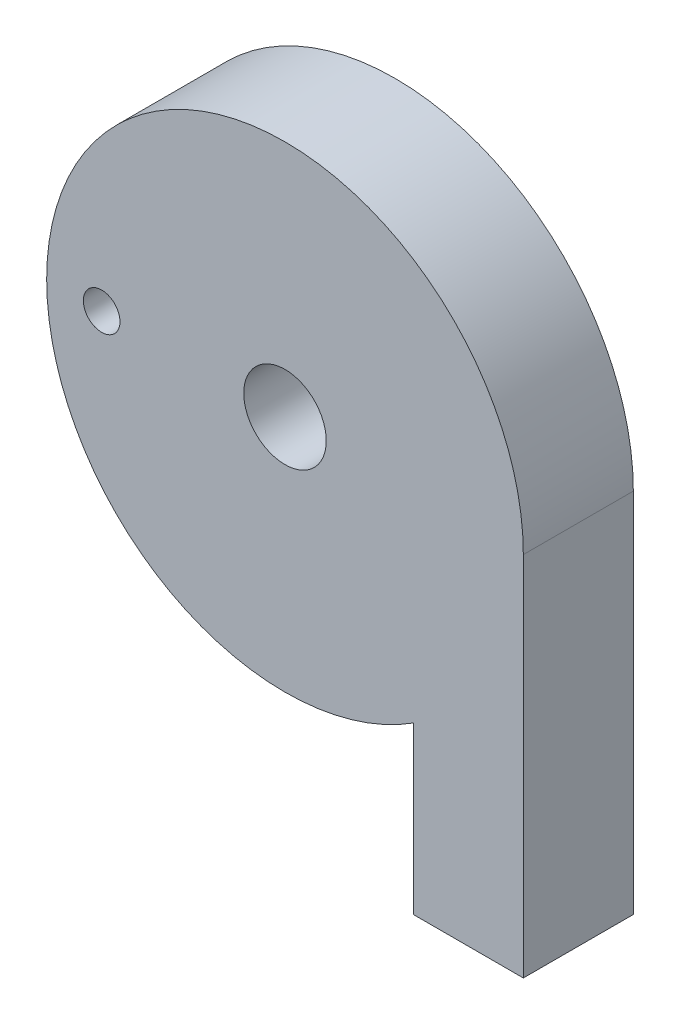
ISO-10303-21;
HEADER;
FILE_DESCRIPTION(('STEP AP214'),'2;1');
FILE_NAME('part.step','',(''),(''),'','','');
FILE_SCHEMA(('AUTOMOTIVE_DESIGN { 1 0 10303 214 1 1 1 1 }'));
ENDSEC;
DATA;
#1=APPLICATION_CONTEXT('core data for automotive mechanical design processes');
#2=APPLICATION_PROTOCOL_DEFINITION('international standard','automotive_design',2000,#1);
#3=PRODUCT_CONTEXT('',#1,'mechanical');
#4=PRODUCT('Part','Part','',(#3));
#5=PRODUCT_RELATED_PRODUCT_CATEGORY('part','',(#4));
#6=PRODUCT_DEFINITION_FORMATION('','',#4);
#7=PRODUCT_DEFINITION_CONTEXT('part definition',#1,'design');
#8=PRODUCT_DEFINITION('design','',#6,#7);
#9=PRODUCT_DEFINITION_SHAPE('','',#8);
#10=(LENGTH_UNIT() NAMED_UNIT(*) SI_UNIT(.MILLI.,.METRE.));
#11=(NAMED_UNIT(*) PLANE_ANGLE_UNIT() SI_UNIT($,.RADIAN.));
#12=(NAMED_UNIT(*) SI_UNIT($,.STERADIAN.) SOLID_ANGLE_UNIT());
#13=UNCERTAINTY_MEASURE_WITH_UNIT(LENGTH_MEASURE(1.E-05),#10,'distance_accuracy_value','');
#14=(GEOMETRIC_REPRESENTATION_CONTEXT(3) GLOBAL_UNCERTAINTY_ASSIGNED_CONTEXT((#13)) GLOBAL_UNIT_ASSIGNED_CONTEXT((#10,
#11,#12)) REPRESENTATION_CONTEXT('',''));
#15=CARTESIAN_POINT('',(0.,0.,0.));
#16=DIRECTION('',(0.,0.,1.));
#17=DIRECTION('',(1.,0.,0.));
#18=AXIS2_PLACEMENT_3D('',#15,#16,#17);
#19=CARTESIAN_POINT('',(0.,0.,3.));
#20=DIRECTION('',(0.,0.,-1.));
#21=DIRECTION('',(-1.,0.,0.));
#22=AXIS2_PLACEMENT_3D('',#19,#20,#21);
#23=CYLINDRICAL_SURFACE('',#22,13.);
#24=CARTESIAN_POINT('',(0.,0.,-3.));
#25=DIRECTION('',(0.,0.,1.));
#26=DIRECTION('',(1.,0.,0.));
#27=AXIS2_PLACEMENT_3D('',#24,#25,#26);
#28=CIRCLE('',#27,13.);
#29=CARTESIAN_POINT('',(13.,0.,-3.));
#30=VERTEX_POINT('',#29);
#31=CARTESIAN_POINT('',(7.,-10.9544511501033,-3.));
#32=VERTEX_POINT('',#31);
#33=EDGE_CURVE('E99',#30,#32,#28,.T.);
#34=ORIENTED_EDGE('',*,*,#33,.T.);
#35=DIRECTION('',(0.,0.,-1.));
#36=VECTOR('',#35,1.);
#37=CARTESIAN_POINT('',(7.,-10.9544511501033,3.));
#38=LINE('',#37,#36);
#39=CARTESIAN_POINT('',(7.,-10.9544511501033,3.));
#40=VERTEX_POINT('',#39);
#41=EDGE_CURVE('E11',#40,#32,#38,.T.);
#42=ORIENTED_EDGE('',*,*,#41,.F.);
#43=CARTESIAN_POINT('',(0.,0.,3.));
#44=DIRECTION('',(0.,0.,1.));
#45=DIRECTION('',(1.,0.,0.));
#46=AXIS2_PLACEMENT_3D('',#43,#44,#45);
#47=CIRCLE('',#46,13.);
#48=CARTESIAN_POINT('',(13.,0.,3.));
#49=VERTEX_POINT('',#48);
#50=EDGE_CURVE('E87',#49,#40,#47,.T.);
#51=ORIENTED_EDGE('',*,*,#50,.F.);
#52=DIRECTION('',(0.,0.,-1.));
#53=VECTOR('',#52,1.);
#54=CARTESIAN_POINT('',(13.,0.,3.));
#55=LINE('',#54,#53);
#56=EDGE_CURVE('E95',#49,#30,#55,.T.);
#57=ORIENTED_EDGE('',*,*,#56,.T.);
#58=EDGE_LOOP('',(#34,#42,#51,#57));
#59=FACE_BOUND('',#58,.T.);
#60=ADVANCED_FACE('F36',(#59),#23,.T.);
#61=CARTESIAN_POINT('',(7.,-20.,3.));
#62=DIRECTION('',(1.,0.,0.));
#63=DIRECTION('',(0.,1.,0.));
#64=AXIS2_PLACEMENT_3D('',#61,#62,#63);
#65=PLANE('',#64);
#66=DIRECTION('',(0.,-1.,0.));
#67=VECTOR('',#66,1.);
#68=CARTESIAN_POINT('',(7.,-20.,-3.));
#69=LINE('',#68,#67);
#70=CARTESIAN_POINT('',(7.,-20.,-3.));
#71=VERTEX_POINT('',#70);
#72=EDGE_CURVE('E91',#32,#71,#69,.T.);
#73=ORIENTED_EDGE('',*,*,#72,.T.);
#74=DIRECTION('',(0.,0.,-1.));
#75=VECTOR('',#74,1.);
#76=CARTESIAN_POINT('',(7.,-20.,3.));
#77=LINE('',#76,#75);
#78=CARTESIAN_POINT('',(7.,-20.,3.));
#79=VERTEX_POINT('',#78);
#80=EDGE_CURVE('E44',#79,#71,#77,.T.);
#81=ORIENTED_EDGE('',*,*,#80,.F.);
#82=DIRECTION('',(0.,-1.,0.));
#83=VECTOR('',#82,1.);
#84=CARTESIAN_POINT('',(7.,-20.,3.));
#85=LINE('',#84,#83);
#86=EDGE_CURVE('E82',#40,#79,#85,.T.);
#87=ORIENTED_EDGE('',*,*,#86,.F.);
#88=ORIENTED_EDGE('',*,*,#41,.T.);
#89=EDGE_LOOP('',(#73,#81,#87,#88));
#90=FACE_BOUND('',#89,.T.);
#91=ADVANCED_FACE('F90',(#90),#65,.F.);
#92=CARTESIAN_POINT('',(13.,-20.,3.));
#93=DIRECTION('',(0.,1.,0.));
#94=DIRECTION('',(0.,0.,1.));
#95=AXIS2_PLACEMENT_3D('',#92,#93,#94);
#96=PLANE('',#95);
#97=CARTESIAN_POINT('',(10.,-20.,0.));
#98=DIRECTION('',(0.,-1.,0.));
#99=DIRECTION('',(0.,0.,-1.));
#100=AXIS2_PLACEMENT_3D('',#97,#98,#99);
#101=CIRCLE('',#100,1.5875);
#102=CARTESIAN_POINT('',(10.,-20.,-1.5875));
#103=VERTEX_POINT('',#102);
#104=EDGE_CURVE('E119',#103,#103,#101,.T.);
#105=ORIENTED_EDGE('',*,*,#104,.F.);
#106=EDGE_LOOP('',(#105));
#107=FACE_BOUND('',#106,.T.);
#108=DIRECTION('',(1.,0.,0.));
#109=VECTOR('',#108,1.);
#110=CARTESIAN_POINT('',(13.,-20.,-3.));
#111=LINE('',#110,#109);
#112=CARTESIAN_POINT('',(13.,-20.,-3.));
#113=VERTEX_POINT('',#112);
#114=EDGE_CURVE('E69',#71,#113,#111,.T.);
#115=ORIENTED_EDGE('',*,*,#114,.T.);
#116=DIRECTION('',(0.,0.,-1.));
#117=VECTOR('',#116,1.);
#118=CARTESIAN_POINT('',(13.,-20.,3.));
#119=LINE('',#118,#117);
#120=CARTESIAN_POINT('',(13.,-20.,3.));
#121=VERTEX_POINT('',#120);
#122=EDGE_CURVE('E92',#121,#113,#119,.T.);
#123=ORIENTED_EDGE('',*,*,#122,.F.);
#124=DIRECTION('',(1.,0.,0.));
#125=VECTOR('',#124,1.);
#126=CARTESIAN_POINT('',(13.,-20.,3.));
#127=LINE('',#126,#125);
#128=EDGE_CURVE('E85',#79,#121,#127,.T.);
#129=ORIENTED_EDGE('',*,*,#128,.F.);
#130=ORIENTED_EDGE('',*,*,#80,.T.);
#131=EDGE_LOOP('',(#115,#123,#129,#130));
#132=FACE_BOUND('',#131,.T.);
#133=ADVANCED_FACE('F93',(#107,#132),#96,.F.);
#134=CARTESIAN_POINT('',(13.,0.,3.));
#135=DIRECTION('',(-1.,0.,0.));
#136=DIRECTION('',(0.,-1.,0.));
#137=AXIS2_PLACEMENT_3D('',#134,#135,#136);
#138=PLANE('',#137);
#139=DIRECTION('',(0.,1.,0.));
#140=VECTOR('',#139,1.);
#141=CARTESIAN_POINT('',(13.,0.,-3.));
#142=LINE('',#141,#140);
#143=EDGE_CURVE('E75',#113,#30,#142,.T.);
#144=ORIENTED_EDGE('',*,*,#143,.T.);
#145=ORIENTED_EDGE('',*,*,#56,.F.);
#146=DIRECTION('',(0.,1.,0.));
#147=VECTOR('',#146,1.);
#148=CARTESIAN_POINT('',(13.,0.,3.));
#149=LINE('',#148,#147);
#150=EDGE_CURVE('E52',#121,#49,#149,.T.);
#151=ORIENTED_EDGE('',*,*,#150,.F.);
#152=ORIENTED_EDGE('',*,*,#122,.T.);
#153=EDGE_LOOP('',(#144,#145,#151,#152));
#154=FACE_BOUND('',#153,.T.);
#155=ADVANCED_FACE('F107',(#154),#138,.F.);
#156=CARTESIAN_POINT('',(0.,0.,3.));
#157=DIRECTION('',(0.,0.,1.));
#158=DIRECTION('',(1.,0.,0.));
#159=AXIS2_PLACEMENT_3D('',#156,#157,#158);
#160=PLANE('',#159);
#161=CARTESIAN_POINT('',(-10.,0.,3.));
#162=DIRECTION('',(0.,0.,1.));
#163=DIRECTION('',(1.,0.,0.));
#164=AXIS2_PLACEMENT_3D('',#161,#162,#163);
#165=CIRCLE('',#164,1.);
#166=CARTESIAN_POINT('',(-9.,0.,3.));
#167=VERTEX_POINT('',#166);
#168=EDGE_CURVE('E125',#167,#167,#165,.T.);
#169=ORIENTED_EDGE('',*,*,#168,.F.);
#170=EDGE_LOOP('',(#169));
#171=FACE_BOUND('',#170,.T.);
#172=CARTESIAN_POINT('',(0.,0.,3.));
#173=DIRECTION('',(0.,0.,1.));
#174=DIRECTION('',(1.,0.,0.));
#175=AXIS2_PLACEMENT_3D('',#172,#173,#174);
#176=CIRCLE('',#175,2.25);
#177=CARTESIAN_POINT('',(2.25,0.,3.));
#178=VERTEX_POINT('',#177);
#179=EDGE_CURVE('E115',#178,#178,#176,.T.);
#180=ORIENTED_EDGE('',*,*,#179,.F.);
#181=EDGE_LOOP('',(#180));
#182=FACE_BOUND('',#181,.T.);
#183=ORIENTED_EDGE('',*,*,#50,.T.);
#184=ORIENTED_EDGE('',*,*,#86,.T.);
#185=ORIENTED_EDGE('',*,*,#128,.T.);
#186=ORIENTED_EDGE('',*,*,#150,.T.);
#187=EDGE_LOOP('',(#183,#184,#185,#186));
#188=FACE_BOUND('',#187,.T.);
#189=ADVANCED_FACE('F83',(#171,#182,#188),#160,.T.);
#190=CARTESIAN_POINT('',(0.,0.,-3.));
#191=DIRECTION('',(0.,0.,1.));
#192=DIRECTION('',(1.,0.,0.));
#193=AXIS2_PLACEMENT_3D('',#190,#191,#192);
#194=PLANE('',#193);
#195=CARTESIAN_POINT('',(-10.,0.,-3.));
#196=DIRECTION('',(0.,0.,1.));
#197=DIRECTION('',(1.,0.,0.));
#198=AXIS2_PLACEMENT_3D('',#195,#196,#197);
#199=CIRCLE('',#198,1.);
#200=CARTESIAN_POINT('',(-9.,0.,-3.));
#201=VERTEX_POINT('',#200);
#202=EDGE_CURVE('E122',#201,#201,#199,.T.);
#203=ORIENTED_EDGE('',*,*,#202,.T.);
#204=EDGE_LOOP('',(#203));
#205=FACE_BOUND('',#204,.T.);
#206=CARTESIAN_POINT('',(0.,0.,-3.));
#207=DIRECTION('',(0.,0.,1.));
#208=DIRECTION('',(1.,0.,0.));
#209=AXIS2_PLACEMENT_3D('',#206,#207,#208);
#210=CIRCLE('',#209,2.25);
#211=CARTESIAN_POINT('',(2.25,0.,-3.));
#212=VERTEX_POINT('',#211);
#213=EDGE_CURVE('E102',#212,#212,#210,.T.);
#214=ORIENTED_EDGE('',*,*,#213,.T.);
#215=EDGE_LOOP('',(#214));
#216=FACE_BOUND('',#215,.T.);
#217=ORIENTED_EDGE('',*,*,#33,.F.);
#218=ORIENTED_EDGE('',*,*,#143,.F.);
#219=ORIENTED_EDGE('',*,*,#114,.F.);
#220=ORIENTED_EDGE('',*,*,#72,.F.);
#221=EDGE_LOOP('',(#217,#218,#219,#220));
#222=FACE_BOUND('',#221,.T.);
#223=ADVANCED_FACE('F110',(#205,#216,#222),#194,.F.);
#224=CARTESIAN_POINT('',(0.,0.,3.));
#225=DIRECTION('',(0.,0.,1.));
#226=DIRECTION('',(1.,0.,0.));
#227=AXIS2_PLACEMENT_3D('',#224,#225,#226);
#228=CYLINDRICAL_SURFACE('',#227,2.25);
#229=ORIENTED_EDGE('',*,*,#213,.F.);
#230=EDGE_LOOP('',(#229));
#231=FACE_BOUND('',#230,.T.);
#232=ORIENTED_EDGE('',*,*,#179,.T.);
#233=EDGE_LOOP('',(#232));
#234=FACE_BOUND('',#233,.T.);
#235=ADVANCED_FACE('F145',(#231,#234),#228,.F.);
#236=CARTESIAN_POINT('',(10.,0.,0.));
#237=DIRECTION('',(0.,-1.,0.));
#238=DIRECTION('',(0.,0.,-1.));
#239=AXIS2_PLACEMENT_3D('',#236,#237,#238);
#240=CYLINDRICAL_SURFACE('',#239,1.5875);
#241=CARTESIAN_POINT('',(10.,0.,0.));
#242=DIRECTION('',(0.,-1.,0.));
#243=DIRECTION('',(0.,0.,-1.));
#244=AXIS2_PLACEMENT_3D('',#241,#242,#243);
#245=CIRCLE('',#244,1.5875);
#246=CARTESIAN_POINT('',(10.,0.,-1.5875));
#247=VERTEX_POINT('',#246);
#248=EDGE_CURVE('E118',#247,#247,#245,.T.);
#249=ORIENTED_EDGE('',*,*,#248,.F.);
#250=EDGE_LOOP('',(#249));
#251=FACE_BOUND('',#250,.T.);
#252=ORIENTED_EDGE('',*,*,#104,.T.);
#253=EDGE_LOOP('',(#252));
#254=FACE_BOUND('',#253,.T.);
#255=ADVANCED_FACE('F147',(#251,#254),#240,.F.);
#256=CARTESIAN_POINT('',(10.,0.,0.));
#257=DIRECTION('',(0.,-1.,0.));
#258=DIRECTION('',(0.,0.,-1.));
#259=AXIS2_PLACEMENT_3D('',#256,#257,#258);
#260=PLANE('',#259);
#261=ORIENTED_EDGE('',*,*,#248,.T.);
#262=EDGE_LOOP('',(#261));
#263=FACE_BOUND('',#262,.T.);
#264=ADVANCED_FACE('F136',(#263),#260,.T.);
#265=CARTESIAN_POINT('',(-10.,0.,-3.));
#266=DIRECTION('',(0.,0.,1.));
#267=DIRECTION('',(1.,0.,0.));
#268=AXIS2_PLACEMENT_3D('',#265,#266,#267);
#269=CYLINDRICAL_SURFACE('',#268,1.);
#270=ORIENTED_EDGE('',*,*,#202,.F.);
#271=EDGE_LOOP('',(#270));
#272=FACE_BOUND('',#271,.T.);
#273=ORIENTED_EDGE('',*,*,#168,.T.);
#274=EDGE_LOOP('',(#273));
#275=FACE_BOUND('',#274,.T.);
#276=ADVANCED_FACE('F133',(#272,#275),#269,.F.);
#277=CLOSED_SHELL('',(#60,#91,#133,#155,#189,#223,#235,#255,#264,#276));
#278=MANIFOLD_SOLID_BREP('B2',#277);
#279=ADVANCED_BREP_SHAPE_REPRESENTATION('',(#18,#278),#14);
#280=SHAPE_DEFINITION_REPRESENTATION(#9,#279);
ENDSEC;
END-ISO-10303-21;
